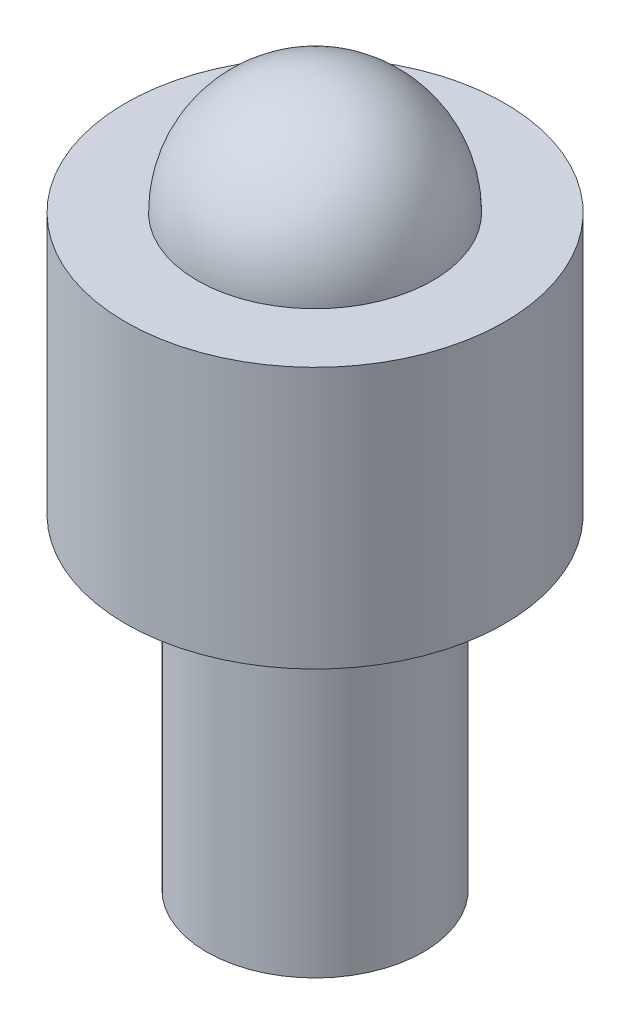
ISO-10303-21;
HEADER;
FILE_DESCRIPTION(('STEP AP214'),'2;1');
FILE_NAME('part.step','',(''),(''),'','','');
FILE_SCHEMA(('AUTOMOTIVE_DESIGN { 1 0 10303 214 1 1 1 1 }'));
ENDSEC;
DATA;
#1=APPLICATION_CONTEXT('core data for automotive mechanical design processes');
#2=APPLICATION_PROTOCOL_DEFINITION('international standard','automotive_design',2000,#1);
#3=PRODUCT_CONTEXT('',#1,'mechanical');
#4=PRODUCT('Part','Part','',(#3));
#5=PRODUCT_RELATED_PRODUCT_CATEGORY('part','',(#4));
#6=PRODUCT_DEFINITION_FORMATION('','',#4);
#7=PRODUCT_DEFINITION_CONTEXT('part definition',#1,'design');
#8=PRODUCT_DEFINITION('design','',#6,#7);
#9=PRODUCT_DEFINITION_SHAPE('','',#8);
#10=(LENGTH_UNIT() NAMED_UNIT(*) SI_UNIT(.MILLI.,.METRE.));
#11=(NAMED_UNIT(*) PLANE_ANGLE_UNIT() SI_UNIT($,.RADIAN.));
#12=(NAMED_UNIT(*) SI_UNIT($,.STERADIAN.) SOLID_ANGLE_UNIT());
#13=UNCERTAINTY_MEASURE_WITH_UNIT(LENGTH_MEASURE(1.E-05),#10,'distance_accuracy_value','');
#14=(GEOMETRIC_REPRESENTATION_CONTEXT(3) GLOBAL_UNCERTAINTY_ASSIGNED_CONTEXT((#13)) GLOBAL_UNIT_ASSIGNED_CONTEXT((#10,
#11,#12)) REPRESENTATION_CONTEXT('',''));
#15=CARTESIAN_POINT('',(0.,0.,0.));
#16=DIRECTION('',(0.,0.,1.));
#17=DIRECTION('',(1.,0.,0.));
#18=AXIS2_PLACEMENT_3D('',#15,#16,#17);
#19=CARTESIAN_POINT('',(0.,12.,0.));
#20=DIRECTION('',(0.,-1.,0.));
#21=DIRECTION('',(0.,0.,-1.));
#22=AXIS2_PLACEMENT_3D('',#19,#20,#21);
#23=CYLINDRICAL_SURFACE('',#22,4.);
#24=CARTESIAN_POINT('',(0.,12.,0.));
#25=DIRECTION('',(0.,1.,0.));
#26=DIRECTION('',(0.,0.,1.));
#27=AXIS2_PLACEMENT_3D('',#24,#25,#26);
#28=CIRCLE('',#27,4.);
#29=CARTESIAN_POINT('',(0.,12.,4.));
#30=VERTEX_POINT('',#29);
#31=EDGE_CURVE('E10',#30,#30,#28,.T.);
#32=ORIENTED_EDGE('',*,*,#31,.F.);
#33=EDGE_LOOP('',(#32));
#34=FACE_BOUND('',#33,.T.);
#35=CARTESIAN_POINT('',(0.,0.,0.));
#36=DIRECTION('',(0.,1.,0.));
#37=DIRECTION('',(0.,0.,1.));
#38=AXIS2_PLACEMENT_3D('',#35,#36,#37);
#39=CIRCLE('',#38,4.);
#40=CARTESIAN_POINT('',(0.,0.,4.));
#41=VERTEX_POINT('',#40);
#42=EDGE_CURVE('E39',#41,#41,#39,.T.);
#43=ORIENTED_EDGE('',*,*,#42,.T.);
#44=EDGE_LOOP('',(#43));
#45=FACE_BOUND('',#44,.T.);
#46=ADVANCED_FACE('F32',(#34,#45),#23,.T.);
#47=CARTESIAN_POINT('',(0.,0.,0.));
#48=DIRECTION('',(0.,1.,0.));
#49=DIRECTION('',(0.,0.,1.));
#50=AXIS2_PLACEMENT_3D('',#47,#48,#49);
#51=PLANE('',#50);
#52=ORIENTED_EDGE('',*,*,#42,.F.);
#53=EDGE_LOOP('',(#52));
#54=FACE_BOUND('',#53,.T.);
#55=ADVANCED_FACE('F57',(#54),#51,.F.);
#56=CARTESIAN_POINT('',(0.,21.65,0.));
#57=DIRECTION('',(0.,-1.,0.));
#58=DIRECTION('',(0.,0.,-1.));
#59=AXIS2_PLACEMENT_3D('',#56,#57,#58);
#60=CYLINDRICAL_SURFACE('',#59,7.);
#61=CARTESIAN_POINT('',(0.,21.65,0.));
#62=DIRECTION('',(0.,1.,0.));
#63=DIRECTION('',(0.,0.,1.));
#64=AXIS2_PLACEMENT_3D('',#61,#62,#63);
#65=CIRCLE('',#64,7.);
#66=CARTESIAN_POINT('',(0.,21.65,7.));
#67=VERTEX_POINT('',#66);
#68=EDGE_CURVE('E44',#67,#67,#65,.T.);
#69=ORIENTED_EDGE('',*,*,#68,.F.);
#70=EDGE_LOOP('',(#69));
#71=FACE_BOUND('',#70,.T.);
#72=CARTESIAN_POINT('',(0.,12.,0.));
#73=DIRECTION('',(0.,1.,0.));
#74=DIRECTION('',(0.,0.,1.));
#75=AXIS2_PLACEMENT_3D('',#72,#73,#74);
#76=CIRCLE('',#75,7.);
#77=CARTESIAN_POINT('',(0.,12.,7.));
#78=VERTEX_POINT('',#77);
#79=EDGE_CURVE('E46',#78,#78,#76,.T.);
#80=ORIENTED_EDGE('',*,*,#79,.T.);
#81=EDGE_LOOP('',(#80));
#82=FACE_BOUND('',#81,.T.);
#83=ADVANCED_FACE('F54',(#71,#82),#60,.T.);
#84=CARTESIAN_POINT('',(0.,21.65,0.));
#85=DIRECTION('',(0.,1.,0.));
#86=DIRECTION('',(0.,0.,1.));
#87=AXIS2_PLACEMENT_3D('',#84,#85,#86);
#88=PLANE('',#87);
#89=CARTESIAN_POINT('',(0.,21.65,0.));
#90=DIRECTION('',(0.,1.,0.));
#91=DIRECTION('',(0.,0.,1.));
#92=AXIS2_PLACEMENT_3D('',#89,#90,#91);
#93=CIRCLE('',#92,4.35);
#94=CARTESIAN_POINT('',(0.,21.65,4.35));
#95=VERTEX_POINT('',#94);
#96=EDGE_CURVE('E35',#95,#95,#93,.F.);
#97=ORIENTED_EDGE('',*,*,#96,.T.);
#98=EDGE_LOOP('',(#97));
#99=FACE_BOUND('',#98,.T.);
#100=ORIENTED_EDGE('',*,*,#68,.T.);
#101=EDGE_LOOP('',(#100));
#102=FACE_BOUND('',#101,.T.);
#103=ADVANCED_FACE('F52',(#99,#102),#88,.T.);
#104=CARTESIAN_POINT('',(0.,12.,0.));
#105=DIRECTION('',(0.,1.,0.));
#106=DIRECTION('',(0.,0.,1.));
#107=AXIS2_PLACEMENT_3D('',#104,#105,#106);
#108=PLANE('',#107);
#109=ORIENTED_EDGE('',*,*,#31,.T.);
#110=EDGE_LOOP('',(#109));
#111=FACE_BOUND('',#110,.T.);
#112=ORIENTED_EDGE('',*,*,#79,.F.);
#113=EDGE_LOOP('',(#112));
#114=FACE_BOUND('',#113,.T.);
#115=ADVANCED_FACE('F61',(#111,#114),#108,.F.);
#116=CARTESIAN_POINT('',(0.,21.65,0.));
#117=DIRECTION('',(0.,0.,-1.));
#118=DIRECTION('',(1.,0.,0.));
#119=AXIS2_PLACEMENT_3D('',#116,#117,#118);
#120=SPHERICAL_SURFACE('',#119,4.35);
#121=CARTESIAN_POINT('',(0.,21.65,0.));
#122=DIRECTION('',(0.,1.,0.));
#123=DIRECTION('',(0.,0.,1.));
#124=AXIS2_PLACEMENT_3D('',#121,#122,#123);
#125=SPHERICAL_SURFACE('',#124,4.35);
#126=ORIENTED_EDGE('',*,*,#96,.F.);
#127=EDGE_LOOP('',(#126));
#128=FACE_BOUND('',#127,.T.);
#129=ADVANCED_FACE('F63',(#128),#125,.T.);
#130=CLOSED_SHELL('',(#46,#55,#83,#103,#115,#129));
#131=MANIFOLD_SOLID_BREP('B2',#130);
#132=ADVANCED_BREP_SHAPE_REPRESENTATION('',(#18,#131),#14);
#133=SHAPE_DEFINITION_REPRESENTATION(#9,#132);
ENDSEC;
END-ISO-10303-21;
